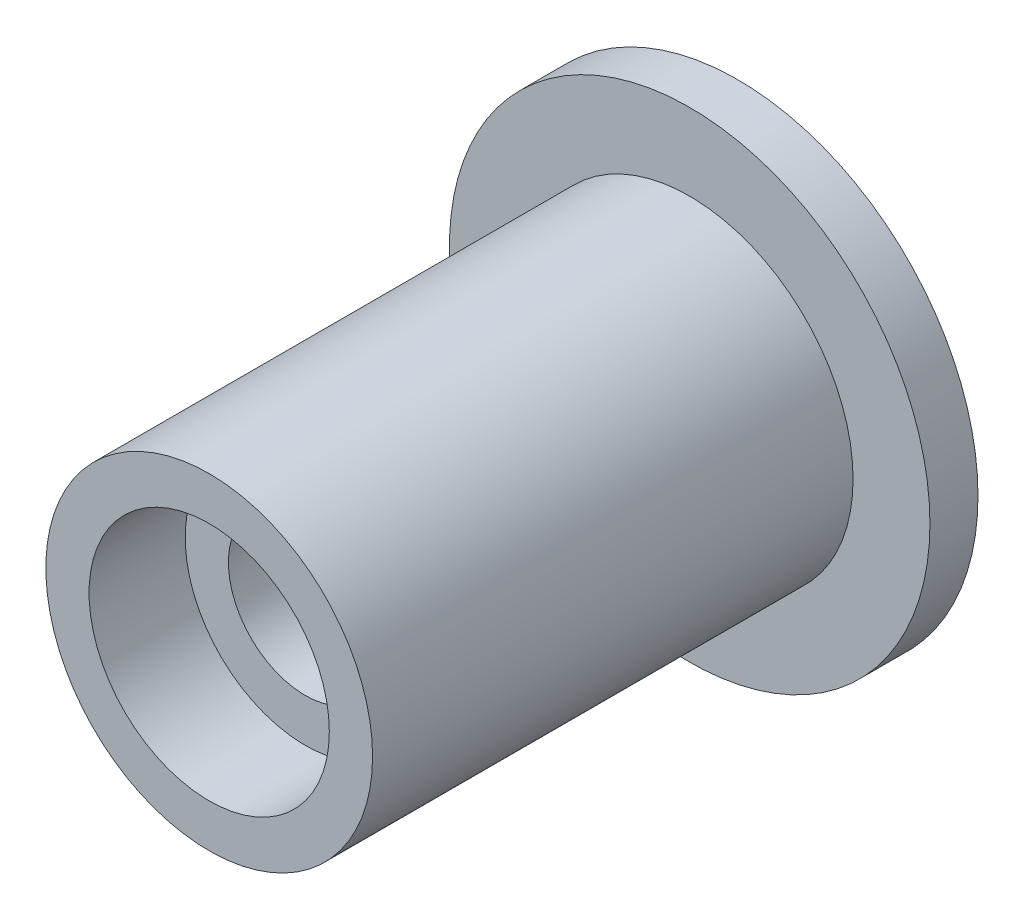
ISO-10303-21;
HEADER;
FILE_DESCRIPTION(('STEP AP214'),'2;1');
FILE_NAME('part.step','',(''),(''),'','','');
FILE_SCHEMA(('AUTOMOTIVE_DESIGN { 1 0 10303 214 1 1 1 1 }'));
ENDSEC;
DATA;
#1=APPLICATION_CONTEXT('core data for automotive mechanical design processes');
#2=APPLICATION_PROTOCOL_DEFINITION('international standard','automotive_design',2000,#1);
#3=PRODUCT_CONTEXT('',#1,'mechanical');
#4=PRODUCT('Part','Part','',(#3));
#5=PRODUCT_RELATED_PRODUCT_CATEGORY('part','',(#4));
#6=PRODUCT_DEFINITION_FORMATION('','',#4);
#7=PRODUCT_DEFINITION_CONTEXT('part definition',#1,'design');
#8=PRODUCT_DEFINITION('design','',#6,#7);
#9=PRODUCT_DEFINITION_SHAPE('','',#8);
#10=(LENGTH_UNIT() NAMED_UNIT(*) SI_UNIT(.MILLI.,.METRE.));
#11=(NAMED_UNIT(*) PLANE_ANGLE_UNIT() SI_UNIT($,.RADIAN.));
#12=(NAMED_UNIT(*) SI_UNIT($,.STERADIAN.) SOLID_ANGLE_UNIT());
#13=UNCERTAINTY_MEASURE_WITH_UNIT(LENGTH_MEASURE(1.E-05),#10,'distance_accuracy_value','');
#14=(GEOMETRIC_REPRESENTATION_CONTEXT(3) GLOBAL_UNCERTAINTY_ASSIGNED_CONTEXT((#13)) GLOBAL_UNIT_ASSIGNED_CONTEXT((#10,
#11,#12)) REPRESENTATION_CONTEXT('',''));
#15=CARTESIAN_POINT('',(0.,0.,0.));
#16=DIRECTION('',(0.,0.,1.));
#17=DIRECTION('',(1.,0.,0.));
#18=AXIS2_PLACEMENT_3D('',#15,#16,#17);
#19=CARTESIAN_POINT('',(0.,0.,-1.));
#20=DIRECTION('',(0.,0.,1.));
#21=DIRECTION('',(1.,0.,0.));
#22=AXIS2_PLACEMENT_3D('',#19,#20,#21);
#23=CYLINDRICAL_SURFACE('',#22,5.);
#24=CARTESIAN_POINT('',(0.,0.,-1.));
#25=DIRECTION('',(0.,0.,1.));
#26=DIRECTION('',(1.,0.,0.));
#27=AXIS2_PLACEMENT_3D('',#24,#25,#26);
#28=CIRCLE('',#27,5.);
#29=CARTESIAN_POINT('',(5.,0.,-1.));
#30=VERTEX_POINT('',#29);
#31=EDGE_CURVE('E54',#30,#30,#28,.T.);
#32=ORIENTED_EDGE('',*,*,#31,.T.);
#33=EDGE_LOOP('',(#32));
#34=FACE_BOUND('',#33,.T.);
#35=CARTESIAN_POINT('',(0.,0.,0.));
#36=DIRECTION('',(0.,0.,1.));
#37=DIRECTION('',(1.,0.,0.));
#38=AXIS2_PLACEMENT_3D('',#35,#36,#37);
#39=CIRCLE('',#38,5.);
#40=CARTESIAN_POINT('',(5.,0.,0.));
#41=VERTEX_POINT('',#40);
#42=EDGE_CURVE('E59',#41,#41,#39,.T.);
#43=ORIENTED_EDGE('',*,*,#42,.F.);
#44=EDGE_LOOP('',(#43));
#45=FACE_BOUND('',#44,.T.);
#46=ADVANCED_FACE('F47',(#34,#45),#23,.T.);
#47=CARTESIAN_POINT('',(0.,0.,-1.));
#48=DIRECTION('',(0.,0.,1.));
#49=DIRECTION('',(1.,0.,0.));
#50=AXIS2_PLACEMENT_3D('',#47,#48,#49);
#51=PLANE('',#50);
#52=CARTESIAN_POINT('',(0.,0.,-1.));
#53=DIRECTION('',(0.,0.,1.));
#54=DIRECTION('',(1.,0.,0.));
#55=AXIS2_PLACEMENT_3D('',#52,#53,#54);
#56=CIRCLE('',#55,1.6);
#57=CARTESIAN_POINT('',(1.6,0.,-1.));
#58=VERTEX_POINT('',#57);
#59=EDGE_CURVE('E65',#58,#58,#56,.T.);
#60=ORIENTED_EDGE('',*,*,#59,.T.);
#61=EDGE_LOOP('',(#60));
#62=FACE_BOUND('',#61,.T.);
#63=ORIENTED_EDGE('',*,*,#31,.F.);
#64=EDGE_LOOP('',(#63));
#65=FACE_BOUND('',#64,.T.);
#66=ADVANCED_FACE('F100',(#62,#65),#51,.F.);
#67=CARTESIAN_POINT('',(0.,0.,0.));
#68=DIRECTION('',(0.,0.,1.));
#69=DIRECTION('',(1.,0.,0.));
#70=AXIS2_PLACEMENT_3D('',#67,#68,#69);
#71=PLANE('',#70);
#72=CARTESIAN_POINT('',(0.,0.,0.));
#73=DIRECTION('',(0.,0.,1.));
#74=DIRECTION('',(1.,0.,0.));
#75=AXIS2_PLACEMENT_3D('',#72,#73,#74);
#76=CIRCLE('',#75,3.4);
#77=CARTESIAN_POINT('',(3.4,0.,0.));
#78=VERTEX_POINT('',#77);
#79=EDGE_CURVE('E71',#78,#78,#76,.T.);
#80=ORIENTED_EDGE('',*,*,#79,.F.);
#81=EDGE_LOOP('',(#80));
#82=FACE_BOUND('',#81,.T.);
#83=ORIENTED_EDGE('',*,*,#42,.T.);
#84=EDGE_LOOP('',(#83));
#85=FACE_BOUND('',#84,.T.);
#86=ADVANCED_FACE('F104',(#82,#85),#71,.T.);
#87=CARTESIAN_POINT('',(0.,0.,-1.));
#88=DIRECTION('',(0.,0.,1.));
#89=DIRECTION('',(1.,0.,0.));
#90=AXIS2_PLACEMENT_3D('',#87,#88,#89);
#91=CYLINDRICAL_SURFACE('',#90,1.6);
#92=ORIENTED_EDGE('',*,*,#59,.F.);
#93=EDGE_LOOP('',(#92));
#94=FACE_BOUND('',#93,.T.);
#95=CARTESIAN_POINT('',(0.,0.,8.));
#96=DIRECTION('',(0.,0.,1.));
#97=DIRECTION('',(1.,0.,0.));
#98=AXIS2_PLACEMENT_3D('',#95,#96,#97);
#99=CIRCLE('',#98,1.6);
#100=CARTESIAN_POINT('',(1.6,0.,8.));
#101=VERTEX_POINT('',#100);
#102=EDGE_CURVE('E76',#101,#101,#99,.T.);
#103=ORIENTED_EDGE('',*,*,#102,.T.);
#104=EDGE_LOOP('',(#103));
#105=FACE_BOUND('',#104,.T.);
#106=ADVANCED_FACE('F87',(#94,#105),#91,.F.);
#107=CARTESIAN_POINT('',(0.,0.,10.));
#108=DIRECTION('',(0.,0.,-1.));
#109=DIRECTION('',(-1.,0.,0.));
#110=AXIS2_PLACEMENT_3D('',#107,#108,#109);
#111=CYLINDRICAL_SURFACE('',#110,2.5);
#112=CARTESIAN_POINT('',(0.,0.,8.));
#113=DIRECTION('',(0.,0.,1.));
#114=DIRECTION('',(1.,0.,0.));
#115=AXIS2_PLACEMENT_3D('',#112,#113,#114);
#116=CIRCLE('',#115,2.5);
#117=CARTESIAN_POINT('',(2.5,0.,8.));
#118=VERTEX_POINT('',#117);
#119=EDGE_CURVE('E11',#118,#118,#116,.T.);
#120=ORIENTED_EDGE('',*,*,#119,.F.);
#121=EDGE_LOOP('',(#120));
#122=FACE_BOUND('',#121,.T.);
#123=CARTESIAN_POINT('',(0.,0.,10.));
#124=DIRECTION('',(0.,0.,1.));
#125=DIRECTION('',(1.,0.,0.));
#126=AXIS2_PLACEMENT_3D('',#123,#124,#125);
#127=CIRCLE('',#126,2.5);
#128=CARTESIAN_POINT('',(2.5,0.,10.));
#129=VERTEX_POINT('',#128);
#130=EDGE_CURVE('E75',#129,#129,#127,.T.);
#131=ORIENTED_EDGE('',*,*,#130,.T.);
#132=EDGE_LOOP('',(#131));
#133=FACE_BOUND('',#132,.T.);
#134=ADVANCED_FACE('F115',(#122,#133),#111,.F.);
#135=CARTESIAN_POINT('',(0.,0.,10.));
#136=DIRECTION('',(0.,0.,-1.));
#137=DIRECTION('',(-1.,0.,0.));
#138=AXIS2_PLACEMENT_3D('',#135,#136,#137);
#139=CYLINDRICAL_SURFACE('',#138,3.4);
#140=CARTESIAN_POINT('',(0.,0.,10.));
#141=DIRECTION('',(0.,0.,1.));
#142=DIRECTION('',(1.,0.,0.));
#143=AXIS2_PLACEMENT_3D('',#140,#141,#142);
#144=CIRCLE('',#143,3.4);
#145=CARTESIAN_POINT('',(3.4,0.,10.));
#146=VERTEX_POINT('',#145);
#147=EDGE_CURVE('E70',#146,#146,#144,.T.);
#148=ORIENTED_EDGE('',*,*,#147,.F.);
#149=EDGE_LOOP('',(#148));
#150=FACE_BOUND('',#149,.T.);
#151=ORIENTED_EDGE('',*,*,#79,.T.);
#152=EDGE_LOOP('',(#151));
#153=FACE_BOUND('',#152,.T.);
#154=ADVANCED_FACE('F96',(#150,#153),#139,.T.);
#155=CARTESIAN_POINT('',(0.,0.,10.));
#156=DIRECTION('',(0.,0.,1.));
#157=DIRECTION('',(1.,0.,0.));
#158=AXIS2_PLACEMENT_3D('',#155,#156,#157);
#159=PLANE('',#158);
#160=ORIENTED_EDGE('',*,*,#130,.F.);
#161=EDGE_LOOP('',(#160));
#162=FACE_BOUND('',#161,.T.);
#163=ORIENTED_EDGE('',*,*,#147,.T.);
#164=EDGE_LOOP('',(#163));
#165=FACE_BOUND('',#164,.T.);
#166=ADVANCED_FACE('F91',(#162,#165),#159,.T.);
#167=CARTESIAN_POINT('',(0.,0.,8.));
#168=DIRECTION('',(0.,0.,1.));
#169=DIRECTION('',(1.,0.,0.));
#170=AXIS2_PLACEMENT_3D('',#167,#168,#169);
#171=PLANE('',#170);
#172=ORIENTED_EDGE('',*,*,#102,.F.);
#173=EDGE_LOOP('',(#172));
#174=FACE_BOUND('',#173,.T.);
#175=ORIENTED_EDGE('',*,*,#119,.T.);
#176=EDGE_LOOP('',(#175));
#177=FACE_BOUND('',#176,.T.);
#178=ADVANCED_FACE('F89',(#174,#177),#171,.T.);
#179=CLOSED_SHELL('',(#46,#66,#86,#106,#134,#154,#166,#178));
#180=MANIFOLD_SOLID_BREP('B2',#179);
#181=ADVANCED_BREP_SHAPE_REPRESENTATION('',(#18,#180),#14);
#182=SHAPE_DEFINITION_REPRESENTATION(#9,#181);
ENDSEC;
END-ISO-10303-21;
